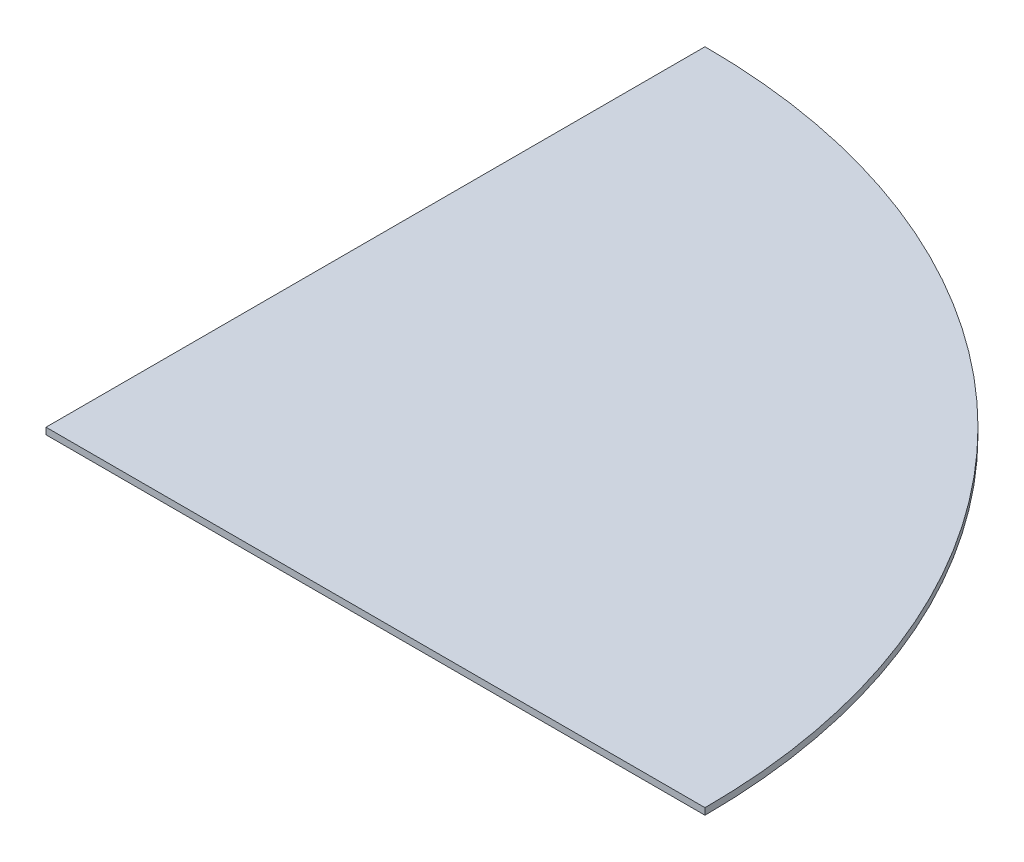
ISO-10303-21;
HEADER;
FILE_DESCRIPTION(('STEP AP214'),'2;1');
FILE_NAME('part.step','',(''),(''),'','','');
FILE_SCHEMA(('AUTOMOTIVE_DESIGN { 1 0 10303 214 1 1 1 1 }'));
ENDSEC;
DATA;
#1=APPLICATION_CONTEXT('core data for automotive mechanical design processes');
#2=APPLICATION_PROTOCOL_DEFINITION('international standard','automotive_design',2000,#1);
#3=PRODUCT_CONTEXT('',#1,'mechanical');
#4=PRODUCT('Part','Part','',(#3));
#5=PRODUCT_RELATED_PRODUCT_CATEGORY('part','',(#4));
#6=PRODUCT_DEFINITION_FORMATION('','',#4);
#7=PRODUCT_DEFINITION_CONTEXT('part definition',#1,'design');
#8=PRODUCT_DEFINITION('design','',#6,#7);
#9=PRODUCT_DEFINITION_SHAPE('','',#8);
#10=(LENGTH_UNIT() NAMED_UNIT(*) SI_UNIT(.MILLI.,.METRE.));
#11=(NAMED_UNIT(*) PLANE_ANGLE_UNIT() SI_UNIT($,.RADIAN.));
#12=(NAMED_UNIT(*) SI_UNIT($,.STERADIAN.) SOLID_ANGLE_UNIT());
#13=UNCERTAINTY_MEASURE_WITH_UNIT(LENGTH_MEASURE(1.E-05),#10,'distance_accuracy_value','');
#14=(GEOMETRIC_REPRESENTATION_CONTEXT(3) GLOBAL_UNCERTAINTY_ASSIGNED_CONTEXT((#13)) GLOBAL_UNIT_ASSIGNED_CONTEXT((#10,
#11,#12)) REPRESENTATION_CONTEXT('',''));
#15=CARTESIAN_POINT('',(0.,0.,0.));
#16=DIRECTION('',(0.,0.,1.));
#17=DIRECTION('',(1.,0.,0.));
#18=AXIS2_PLACEMENT_3D('',#15,#16,#17);
#19=CARTESIAN_POINT('',(0.,10.,0.));
#20=DIRECTION('',(0.,0.,-1.));
#21=DIRECTION('',(-1.,0.,0.));
#22=AXIS2_PLACEMENT_3D('',#19,#20,#21);
#23=PLANE('',#22);
#24=DIRECTION('',(1.,0.,0.));
#25=VECTOR('',#24,1.);
#26=CARTESIAN_POINT('',(0.,0.,0.));
#27=LINE('',#26,#25);
#28=CARTESIAN_POINT('',(0.,0.,0.));
#29=VERTEX_POINT('',#28);
#30=CARTESIAN_POINT('',(1000.,0.,0.));
#31=VERTEX_POINT('',#30);
#32=EDGE_CURVE('E89',#29,#31,#27,.T.);
#33=ORIENTED_EDGE('',*,*,#32,.T.);
#34=DIRECTION('',(0.,-1.,0.));
#35=VECTOR('',#34,1.);
#36=CARTESIAN_POINT('',(1000.,10.,0.));
#37=LINE('',#36,#35);
#38=CARTESIAN_POINT('',(1000.,10.,0.));
#39=VERTEX_POINT('',#38);
#40=EDGE_CURVE('E12',#39,#31,#37,.T.);
#41=ORIENTED_EDGE('',*,*,#40,.F.);
#42=DIRECTION('',(1.,0.,0.));
#43=VECTOR('',#42,1.);
#44=CARTESIAN_POINT('',(0.,10.,0.));
#45=LINE('',#44,#43);
#46=CARTESIAN_POINT('',(0.,10.,0.));
#47=VERTEX_POINT('',#46);
#48=EDGE_CURVE('E83',#47,#39,#45,.T.);
#49=ORIENTED_EDGE('',*,*,#48,.F.);
#50=DIRECTION('',(0.,-1.,0.));
#51=VECTOR('',#50,1.);
#52=CARTESIAN_POINT('',(0.,10.,0.));
#53=LINE('',#52,#51);
#54=EDGE_CURVE('E90',#47,#29,#53,.T.);
#55=ORIENTED_EDGE('',*,*,#54,.T.);
#56=EDGE_LOOP('',(#33,#41,#49,#55));
#57=FACE_BOUND('',#56,.T.);
#58=ADVANCED_FACE('F43',(#57),#23,.F.);
#59=CARTESIAN_POINT('',(0.,10.,0.));
#60=DIRECTION('',(0.,-1.,0.));
#61=DIRECTION('',(0.,0.,-1.));
#62=AXIS2_PLACEMENT_3D('',#59,#60,#61);
#63=CYLINDRICAL_SURFACE('',#62,1000.);
#64=CARTESIAN_POINT('',(0.,0.,0.));
#65=DIRECTION('',(0.,1.,0.));
#66=DIRECTION('',(0.,0.,-1.));
#67=AXIS2_PLACEMENT_3D('',#64,#65,#66);
#68=CIRCLE('',#67,1000.);
#69=CARTESIAN_POINT('',(0.,0.,-1000.));
#70=VERTEX_POINT('',#69);
#71=EDGE_CURVE('E71',#31,#70,#68,.T.);
#72=ORIENTED_EDGE('',*,*,#71,.T.);
#73=DIRECTION('',(0.,-1.,0.));
#74=VECTOR('',#73,1.);
#75=CARTESIAN_POINT('',(0.,10.,-1000.));
#76=LINE('',#75,#74);
#77=CARTESIAN_POINT('',(0.,10.,-1000.));
#78=VERTEX_POINT('',#77);
#79=EDGE_CURVE('E51',#78,#70,#76,.T.);
#80=ORIENTED_EDGE('',*,*,#79,.F.);
#81=CARTESIAN_POINT('',(0.,10.,0.));
#82=DIRECTION('',(0.,1.,0.));
#83=DIRECTION('',(0.,0.,-1.));
#84=AXIS2_PLACEMENT_3D('',#81,#82,#83);
#85=CIRCLE('',#84,1000.);
#86=EDGE_CURVE('E79',#39,#78,#85,.T.);
#87=ORIENTED_EDGE('',*,*,#86,.F.);
#88=ORIENTED_EDGE('',*,*,#40,.T.);
#89=EDGE_LOOP('',(#72,#80,#87,#88));
#90=FACE_BOUND('',#89,.T.);
#91=ADVANCED_FACE('F80',(#90),#63,.T.);
#92=CARTESIAN_POINT('',(0.,10.,0.));
#93=DIRECTION('',(1.,0.,0.));
#94=DIRECTION('',(0.,0.,-1.));
#95=AXIS2_PLACEMENT_3D('',#92,#93,#94);
#96=PLANE('',#95);
#97=DIRECTION('',(0.,0.,1.));
#98=VECTOR('',#97,1.);
#99=CARTESIAN_POINT('',(0.,0.,0.));
#100=LINE('',#99,#98);
#101=EDGE_CURVE('E76',#70,#29,#100,.T.);
#102=ORIENTED_EDGE('',*,*,#101,.T.);
#103=ORIENTED_EDGE('',*,*,#54,.F.);
#104=DIRECTION('',(0.,0.,1.));
#105=VECTOR('',#104,1.);
#106=CARTESIAN_POINT('',(0.,10.,0.));
#107=LINE('',#106,#105);
#108=EDGE_CURVE('E59',#78,#47,#107,.T.);
#109=ORIENTED_EDGE('',*,*,#108,.F.);
#110=ORIENTED_EDGE('',*,*,#79,.T.);
#111=EDGE_LOOP('',(#102,#103,#109,#110));
#112=FACE_BOUND('',#111,.T.);
#113=ADVANCED_FACE('F98',(#112),#96,.F.);
#114=CARTESIAN_POINT('',(0.,10.,0.));
#115=DIRECTION('',(0.,-1.,0.));
#116=DIRECTION('',(0.,0.,-1.));
#117=AXIS2_PLACEMENT_3D('',#114,#115,#116);
#118=PLANE('',#117);
#119=ORIENTED_EDGE('',*,*,#48,.T.);
#120=ORIENTED_EDGE('',*,*,#86,.T.);
#121=ORIENTED_EDGE('',*,*,#108,.T.);
#122=EDGE_LOOP('',(#119,#120,#121));
#123=FACE_BOUND('',#122,.T.);
#124=ADVANCED_FACE('F85',(#123),#118,.F.);
#125=CARTESIAN_POINT('',(0.,0.,0.));
#126=DIRECTION('',(0.,-1.,0.));
#127=DIRECTION('',(0.,0.,-1.));
#128=AXIS2_PLACEMENT_3D('',#125,#126,#127);
#129=PLANE('',#128);
#130=ORIENTED_EDGE('',*,*,#32,.F.);
#131=ORIENTED_EDGE('',*,*,#101,.F.);
#132=ORIENTED_EDGE('',*,*,#71,.F.);
#133=EDGE_LOOP('',(#130,#131,#132));
#134=FACE_BOUND('',#133,.T.);
#135=ADVANCED_FACE('F99',(#134),#129,.T.);
#136=CLOSED_SHELL('',(#58,#91,#113,#124,#135));
#137=MANIFOLD_SOLID_BREP('B2',#136);
#138=ADVANCED_BREP_SHAPE_REPRESENTATION('',(#18,#137),#14);
#139=SHAPE_DEFINITION_REPRESENTATION(#9,#138);
ENDSEC;
END-ISO-10303-21;
